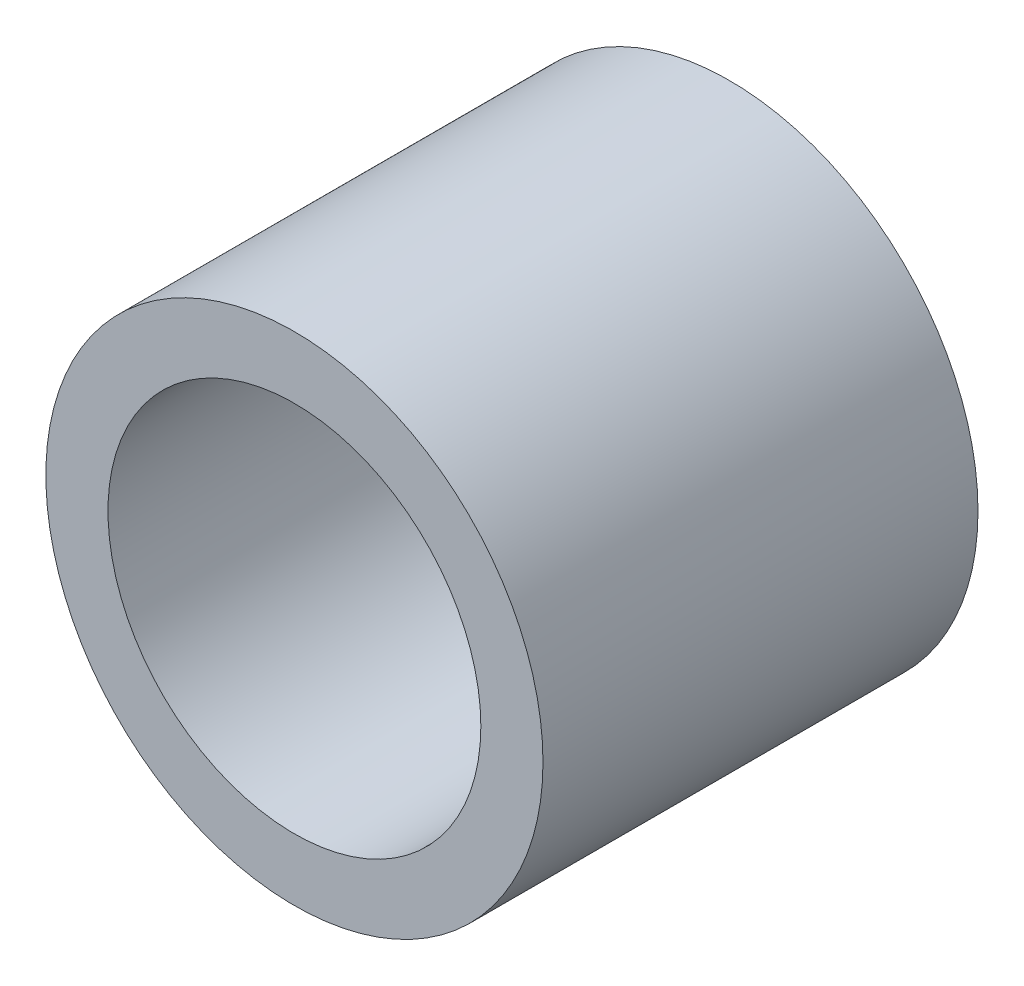
ISO-10303-21;
HEADER;
FILE_DESCRIPTION(('STEP AP214'),'2;1');
FILE_NAME('part.step','',(''),(''),'','','');
FILE_SCHEMA(('AUTOMOTIVE_DESIGN { 1 0 10303 214 1 1 1 1 }'));
ENDSEC;
DATA;
#1=APPLICATION_CONTEXT('core data for automotive mechanical design processes');
#2=APPLICATION_PROTOCOL_DEFINITION('international standard','automotive_design',2000,#1);
#3=PRODUCT_CONTEXT('',#1,'mechanical');
#4=PRODUCT('Part','Part','',(#3));
#5=PRODUCT_RELATED_PRODUCT_CATEGORY('part','',(#4));
#6=PRODUCT_DEFINITION_FORMATION('','',#4);
#7=PRODUCT_DEFINITION_CONTEXT('part definition',#1,'design');
#8=PRODUCT_DEFINITION('design','',#6,#7);
#9=PRODUCT_DEFINITION_SHAPE('','',#8);
#10=(LENGTH_UNIT() NAMED_UNIT(*) SI_UNIT(.MILLI.,.METRE.));
#11=(NAMED_UNIT(*) PLANE_ANGLE_UNIT() SI_UNIT($,.RADIAN.));
#12=(NAMED_UNIT(*) SI_UNIT($,.STERADIAN.) SOLID_ANGLE_UNIT());
#13=UNCERTAINTY_MEASURE_WITH_UNIT(LENGTH_MEASURE(1.E-05),#10,'distance_accuracy_value','');
#14=(GEOMETRIC_REPRESENTATION_CONTEXT(3) GLOBAL_UNCERTAINTY_ASSIGNED_CONTEXT((#13)) GLOBAL_UNIT_ASSIGNED_CONTEXT((#10,
#11,#12)) REPRESENTATION_CONTEXT('',''));
#15=CARTESIAN_POINT('',(0.,0.,0.));
#16=DIRECTION('',(0.,0.,1.));
#17=DIRECTION('',(1.,0.,0.));
#18=AXIS2_PLACEMENT_3D('',#15,#16,#17);
#19=CARTESIAN_POINT('',(0.,0.,70.));
#20=DIRECTION('',(0.,0.,1.));
#21=DIRECTION('',(1.,0.,0.));
#22=AXIS2_PLACEMENT_3D('',#19,#20,#21);
#23=PLANE('',#22);
#24=CARTESIAN_POINT('',(0.,0.,70.));
#25=DIRECTION('',(0.,0.,1.));
#26=DIRECTION('',(1.,0.,0.));
#27=AXIS2_PLACEMENT_3D('',#24,#25,#26);
#28=CIRCLE('',#27,40.);
#29=CARTESIAN_POINT('',(40.,0.,70.));
#30=VERTEX_POINT('',#29);
#31=EDGE_CURVE('E10',#30,#30,#28,.T.);
#32=ORIENTED_EDGE('',*,*,#31,.T.);
#33=EDGE_LOOP('',(#32));
#34=FACE_BOUND('',#33,.T.);
#35=CARTESIAN_POINT('',(0.,0.,70.));
#36=DIRECTION('',(0.,0.,1.));
#37=DIRECTION('',(1.,0.,0.));
#38=AXIS2_PLACEMENT_3D('',#35,#36,#37);
#39=CIRCLE('',#38,30.);
#40=CARTESIAN_POINT('',(30.,0.,70.));
#41=VERTEX_POINT('',#40);
#42=EDGE_CURVE('E41',#41,#41,#39,.T.);
#43=ORIENTED_EDGE('',*,*,#42,.F.);
#44=EDGE_LOOP('',(#43));
#45=FACE_BOUND('',#44,.T.);
#46=ADVANCED_FACE('F30',(#34,#45),#23,.T.);
#47=CARTESIAN_POINT('',(0.,0.,0.));
#48=DIRECTION('',(0.,0.,1.));
#49=DIRECTION('',(1.,0.,0.));
#50=AXIS2_PLACEMENT_3D('',#47,#48,#49);
#51=PLANE('',#50);
#52=CARTESIAN_POINT('',(0.,0.,0.));
#53=DIRECTION('',(0.,0.,1.));
#54=DIRECTION('',(1.,0.,0.));
#55=AXIS2_PLACEMENT_3D('',#52,#53,#54);
#56=CIRCLE('',#55,40.);
#57=CARTESIAN_POINT('',(40.,0.,0.));
#58=VERTEX_POINT('',#57);
#59=EDGE_CURVE('E34',#58,#58,#56,.T.);
#60=ORIENTED_EDGE('',*,*,#59,.F.);
#61=EDGE_LOOP('',(#60));
#62=FACE_BOUND('',#61,.T.);
#63=CARTESIAN_POINT('',(0.,0.,0.));
#64=DIRECTION('',(0.,0.,1.));
#65=DIRECTION('',(1.,0.,0.));
#66=AXIS2_PLACEMENT_3D('',#63,#64,#65);
#67=CIRCLE('',#66,30.);
#68=CARTESIAN_POINT('',(30.,0.,0.));
#69=VERTEX_POINT('',#68);
#70=EDGE_CURVE('E43',#69,#69,#67,.T.);
#71=ORIENTED_EDGE('',*,*,#70,.T.);
#72=EDGE_LOOP('',(#71));
#73=FACE_BOUND('',#72,.T.);
#74=ADVANCED_FACE('F53',(#62,#73),#51,.F.);
#75=CARTESIAN_POINT('',(0.,0.,70.));
#76=DIRECTION('',(0.,0.,-1.));
#77=DIRECTION('',(-1.,0.,0.));
#78=AXIS2_PLACEMENT_3D('',#75,#76,#77);
#79=CYLINDRICAL_SURFACE('',#78,40.);
#80=ORIENTED_EDGE('',*,*,#31,.F.);
#81=EDGE_LOOP('',(#80));
#82=FACE_BOUND('',#81,.T.);
#83=ORIENTED_EDGE('',*,*,#59,.T.);
#84=EDGE_LOOP('',(#83));
#85=FACE_BOUND('',#84,.T.);
#86=ADVANCED_FACE('F32',(#82,#85),#79,.T.);
#87=CARTESIAN_POINT('',(0.,0.,70.));
#88=DIRECTION('',(0.,0.,-1.));
#89=DIRECTION('',(-1.,0.,0.));
#90=AXIS2_PLACEMENT_3D('',#87,#88,#89);
#91=CYLINDRICAL_SURFACE('',#90,30.);
#92=ORIENTED_EDGE('',*,*,#42,.T.);
#93=EDGE_LOOP('',(#92));
#94=FACE_BOUND('',#93,.T.);
#95=ORIENTED_EDGE('',*,*,#70,.F.);
#96=EDGE_LOOP('',(#95));
#97=FACE_BOUND('',#96,.T.);
#98=ADVANCED_FACE('F49',(#94,#97),#91,.F.);
#99=CLOSED_SHELL('',(#46,#74,#86,#98));
#100=MANIFOLD_SOLID_BREP('B2',#99);
#101=ADVANCED_BREP_SHAPE_REPRESENTATION('',(#18,#100),#14);
#102=SHAPE_DEFINITION_REPRESENTATION(#9,#101);
ENDSEC;
END-ISO-10303-21;
